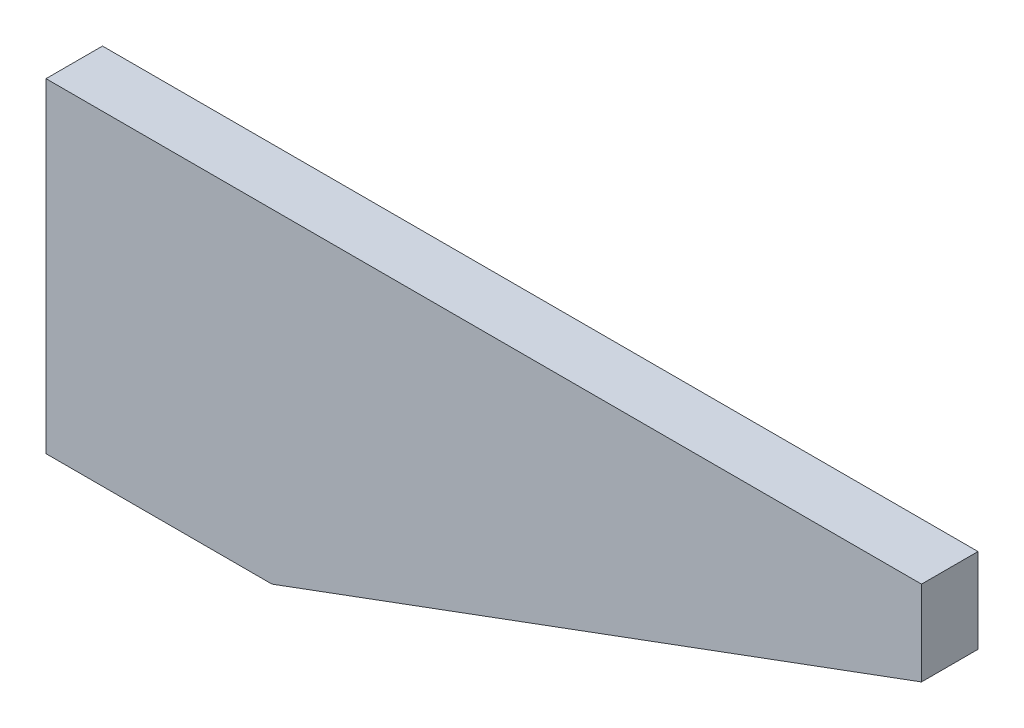
ISO-10303-21;
HEADER;
FILE_DESCRIPTION(('STEP AP214'),'2;1');
FILE_NAME('part.step','',(''),(''),'','','');
FILE_SCHEMA(('AUTOMOTIVE_DESIGN { 1 0 10303 214 1 1 1 1 }'));
ENDSEC;
DATA;
#1=APPLICATION_CONTEXT('core data for automotive mechanical design processes');
#2=APPLICATION_PROTOCOL_DEFINITION('international standard','automotive_design',2000,#1);
#3=PRODUCT_CONTEXT('',#1,'mechanical');
#4=PRODUCT('Part','Part','',(#3));
#5=PRODUCT_RELATED_PRODUCT_CATEGORY('part','',(#4));
#6=PRODUCT_DEFINITION_FORMATION('','',#4);
#7=PRODUCT_DEFINITION_CONTEXT('part definition',#1,'design');
#8=PRODUCT_DEFINITION('design','',#6,#7);
#9=PRODUCT_DEFINITION_SHAPE('','',#8);
#10=(LENGTH_UNIT() NAMED_UNIT(*) SI_UNIT(.MILLI.,.METRE.));
#11=(NAMED_UNIT(*) PLANE_ANGLE_UNIT() SI_UNIT($,.RADIAN.));
#12=(NAMED_UNIT(*) SI_UNIT($,.STERADIAN.) SOLID_ANGLE_UNIT());
#13=UNCERTAINTY_MEASURE_WITH_UNIT(LENGTH_MEASURE(1.E-05),#10,'distance_accuracy_value','');
#14=(GEOMETRIC_REPRESENTATION_CONTEXT(3) GLOBAL_UNCERTAINTY_ASSIGNED_CONTEXT((#13)) GLOBAL_UNIT_ASSIGNED_CONTEXT((#10,
#11,#12)) REPRESENTATION_CONTEXT('',''));
#15=CARTESIAN_POINT('',(0.,0.,0.));
#16=DIRECTION('',(0.,0.,1.));
#17=DIRECTION('',(1.,0.,0.));
#18=AXIS2_PLACEMENT_3D('',#15,#16,#17);
#19=CARTESIAN_POINT('',(-17.4568345323741,7.65287769784173,2.));
#20=DIRECTION('',(0.,-1.,0.));
#21=DIRECTION('',(0.,0.,-1.));
#22=AXIS2_PLACEMENT_3D('',#19,#20,#21);
#23=PLANE('',#22);
#24=DIRECTION('',(-1.,0.,0.));
#25=VECTOR('',#24,1.);
#26=CARTESIAN_POINT('',(-17.4568345323741,7.65287769784173,0.));
#27=LINE('',#26,#25);
#28=CARTESIAN_POINT('',(13.5431654676259,7.65287769784173,0.));
#29=VERTEX_POINT('',#28);
#30=CARTESIAN_POINT('',(-17.4568345323741,7.65287769784173,0.));
#31=VERTEX_POINT('',#30);
#32=EDGE_CURVE('E107',#29,#31,#27,.T.);
#33=ORIENTED_EDGE('',*,*,#32,.T.);
#34=DIRECTION('',(0.,0.,-1.));
#35=VECTOR('',#34,1.);
#36=CARTESIAN_POINT('',(-17.4568345323741,7.65287769784173,2.));
#37=LINE('',#36,#35);
#38=CARTESIAN_POINT('',(-17.4568345323741,7.65287769784173,2.));
#39=VERTEX_POINT('',#38);
#40=EDGE_CURVE('E11',#39,#31,#37,.T.);
#41=ORIENTED_EDGE('',*,*,#40,.F.);
#42=DIRECTION('',(-1.,0.,0.));
#43=VECTOR('',#42,1.);
#44=CARTESIAN_POINT('',(-17.4568345323741,7.65287769784173,2.));
#45=LINE('',#44,#43);
#46=CARTESIAN_POINT('',(13.5431654676259,7.65287769784173,2.));
#47=VERTEX_POINT('',#46);
#48=EDGE_CURVE('E115',#47,#39,#45,.T.);
#49=ORIENTED_EDGE('',*,*,#48,.F.);
#50=DIRECTION('',(0.,0.,-1.));
#51=VECTOR('',#50,1.);
#52=CARTESIAN_POINT('',(13.5431654676259,7.65287769784173,2.));
#53=LINE('',#52,#51);
#54=EDGE_CURVE('E103',#47,#29,#53,.T.);
#55=ORIENTED_EDGE('',*,*,#54,.T.);
#56=EDGE_LOOP('',(#33,#41,#49,#55));
#57=FACE_BOUND('',#56,.T.);
#58=ADVANCED_FACE('F33',(#57),#23,.F.);
#59=CARTESIAN_POINT('',(-17.4568345323741,7.65287769784173,2.));
#60=DIRECTION('',(1.,0.,0.));
#61=DIRECTION('',(0.,0.,-1.));
#62=AXIS2_PLACEMENT_3D('',#59,#60,#61);
#63=PLANE('',#62);
#64=DIRECTION('',(0.,-1.,0.));
#65=VECTOR('',#64,1.);
#66=CARTESIAN_POINT('',(-17.4568345323741,7.65287769784173,0.));
#67=LINE('',#66,#65);
#68=CARTESIAN_POINT('',(-17.4568345323741,-3.84712230215827,0.));
#69=VERTEX_POINT('',#68);
#70=EDGE_CURVE('E110',#31,#69,#67,.T.);
#71=ORIENTED_EDGE('',*,*,#70,.T.);
#72=DIRECTION('',(0.,0.,-1.));
#73=VECTOR('',#72,1.);
#74=CARTESIAN_POINT('',(-17.4568345323741,-3.84712230215827,2.));
#75=LINE('',#74,#73);
#76=CARTESIAN_POINT('',(-17.4568345323741,-3.84712230215827,2.));
#77=VERTEX_POINT('',#76);
#78=EDGE_CURVE('E41',#77,#69,#75,.T.);
#79=ORIENTED_EDGE('',*,*,#78,.F.);
#80=DIRECTION('',(0.,-1.,0.));
#81=VECTOR('',#80,1.);
#82=CARTESIAN_POINT('',(-17.4568345323741,7.65287769784173,2.));
#83=LINE('',#82,#81);
#84=EDGE_CURVE('E83',#39,#77,#83,.T.);
#85=ORIENTED_EDGE('',*,*,#84,.F.);
#86=ORIENTED_EDGE('',*,*,#40,.T.);
#87=EDGE_LOOP('',(#71,#79,#85,#86));
#88=FACE_BOUND('',#87,.T.);
#89=ADVANCED_FACE('F134',(#88),#63,.F.);
#90=CARTESIAN_POINT('',(-17.4568345323741,-3.84712230215827,2.));
#91=DIRECTION('',(0.,1.,0.));
#92=DIRECTION('',(0.,0.,1.));
#93=AXIS2_PLACEMENT_3D('',#90,#91,#92);
#94=PLANE('',#93);
#95=DIRECTION('',(1.,0.,0.));
#96=VECTOR('',#95,1.);
#97=CARTESIAN_POINT('',(-17.4568345323741,-3.84712230215827,0.));
#98=LINE('',#97,#96);
#99=CARTESIAN_POINT('',(-9.4568345323741,-3.84712230215827,0.));
#100=VERTEX_POINT('',#99);
#101=EDGE_CURVE('E98',#69,#100,#98,.T.);
#102=ORIENTED_EDGE('',*,*,#101,.T.);
#103=DIRECTION('',(0.,0.,-1.));
#104=VECTOR('',#103,1.);
#105=CARTESIAN_POINT('',(-9.4568345323741,-3.84712230215827,2.));
#106=LINE('',#105,#104);
#107=CARTESIAN_POINT('',(-9.4568345323741,-3.84712230215827,2.));
#108=VERTEX_POINT('',#107);
#109=EDGE_CURVE('E95',#108,#100,#106,.T.);
#110=ORIENTED_EDGE('',*,*,#109,.F.);
#111=DIRECTION('',(1.,0.,0.));
#112=VECTOR('',#111,1.);
#113=CARTESIAN_POINT('',(-17.4568345323741,-3.84712230215827,2.));
#114=LINE('',#113,#112);
#115=EDGE_CURVE('E87',#77,#108,#114,.T.);
#116=ORIENTED_EDGE('',*,*,#115,.F.);
#117=ORIENTED_EDGE('',*,*,#78,.T.);
#118=EDGE_LOOP('',(#102,#110,#116,#117));
#119=FACE_BOUND('',#118,.T.);
#120=ADVANCED_FACE('F96',(#119),#94,.F.);
#121=CARTESIAN_POINT('',(-9.4568345323741,-3.84712230215827,2.));
#122=DIRECTION('',(-0.346650140871629,0.937994498829114,0.));
#123=DIRECTION('',(-0.937994498829114,-0.346650140871629,0.));
#124=AXIS2_PLACEMENT_3D('',#121,#122,#123);
#125=PLANE('',#124);
#126=DIRECTION('',(0.937994498829114,0.346650140871629,0.));
#127=VECTOR('',#126,1.);
#128=CARTESIAN_POINT('',(-9.4568345323741,-3.84712230215827,0.));
#129=LINE('',#128,#127);
#130=CARTESIAN_POINT('',(13.5431654676259,4.65287769784173,0.));
#131=VERTEX_POINT('',#130);
#132=EDGE_CURVE('E69',#100,#131,#129,.T.);
#133=ORIENTED_EDGE('',*,*,#132,.T.);
#134=DIRECTION('',(0.,0.,-1.));
#135=VECTOR('',#134,1.);
#136=CARTESIAN_POINT('',(13.5431654676259,4.65287769784173,2.));
#137=LINE('',#136,#135);
#138=CARTESIAN_POINT('',(13.5431654676259,4.65287769784173,2.));
#139=VERTEX_POINT('',#138);
#140=EDGE_CURVE('E99',#139,#131,#137,.T.);
#141=ORIENTED_EDGE('',*,*,#140,.F.);
#142=DIRECTION('',(0.937994498829114,0.346650140871629,0.));
#143=VECTOR('',#142,1.);
#144=CARTESIAN_POINT('',(-9.4568345323741,-3.84712230215827,2.));
#145=LINE('',#144,#143);
#146=EDGE_CURVE('E91',#108,#139,#145,.T.);
#147=ORIENTED_EDGE('',*,*,#146,.F.);
#148=ORIENTED_EDGE('',*,*,#109,.T.);
#149=EDGE_LOOP('',(#133,#141,#147,#148));
#150=FACE_BOUND('',#149,.T.);
#151=ADVANCED_FACE('F101',(#150),#125,.F.);
#152=CARTESIAN_POINT('',(13.5431654676259,7.65287769784173,2.));
#153=DIRECTION('',(-1.,0.,0.));
#154=DIRECTION('',(0.,0.,1.));
#155=AXIS2_PLACEMENT_3D('',#152,#153,#154);
#156=PLANE('',#155);
#157=DIRECTION('',(0.,1.,0.));
#158=VECTOR('',#157,1.);
#159=CARTESIAN_POINT('',(13.5431654676259,7.65287769784173,0.));
#160=LINE('',#159,#158);
#161=EDGE_CURVE('E75',#131,#29,#160,.T.);
#162=ORIENTED_EDGE('',*,*,#161,.T.);
#163=ORIENTED_EDGE('',*,*,#54,.F.);
#164=DIRECTION('',(0.,1.,0.));
#165=VECTOR('',#164,1.);
#166=CARTESIAN_POINT('',(13.5431654676259,7.65287769784173,2.));
#167=LINE('',#166,#165);
#168=EDGE_CURVE('E49',#139,#47,#167,.T.);
#169=ORIENTED_EDGE('',*,*,#168,.F.);
#170=ORIENTED_EDGE('',*,*,#140,.T.);
#171=EDGE_LOOP('',(#162,#163,#169,#170));
#172=FACE_BOUND('',#171,.T.);
#173=ADVANCED_FACE('F123',(#172),#156,.F.);
#174=CARTESIAN_POINT('',(0.,0.,2.));
#175=DIRECTION('',(0.,0.,-1.));
#176=DIRECTION('',(-1.,0.,0.));
#177=AXIS2_PLACEMENT_3D('',#174,#175,#176);
#178=PLANE('',#177);
#179=ORIENTED_EDGE('',*,*,#48,.T.);
#180=ORIENTED_EDGE('',*,*,#84,.T.);
#181=ORIENTED_EDGE('',*,*,#115,.T.);
#182=ORIENTED_EDGE('',*,*,#146,.T.);
#183=ORIENTED_EDGE('',*,*,#168,.T.);
#184=EDGE_LOOP('',(#179,#180,#181,#182,#183));
#185=FACE_BOUND('',#184,.T.);
#186=ADVANCED_FACE('F89',(#185),#178,.F.);
#187=CARTESIAN_POINT('',(0.,0.,0.));
#188=DIRECTION('',(0.,0.,-1.));
#189=DIRECTION('',(-1.,0.,0.));
#190=AXIS2_PLACEMENT_3D('',#187,#188,#189);
#191=PLANE('',#190);
#192=ORIENTED_EDGE('',*,*,#32,.F.);
#193=ORIENTED_EDGE('',*,*,#161,.F.);
#194=ORIENTED_EDGE('',*,*,#132,.F.);
#195=ORIENTED_EDGE('',*,*,#101,.F.);
#196=ORIENTED_EDGE('',*,*,#70,.F.);
#197=EDGE_LOOP('',(#192,#193,#194,#195,#196));
#198=FACE_BOUND('',#197,.T.);
#199=ADVANCED_FACE('F119',(#198),#191,.T.);
#200=CLOSED_SHELL('',(#58,#89,#120,#151,#173,#186,#199));
#201=MANIFOLD_SOLID_BREP('B2',#200);
#202=ADVANCED_BREP_SHAPE_REPRESENTATION('',(#18,#201),#14);
#203=SHAPE_DEFINITION_REPRESENTATION(#9,#202);
ENDSEC;
END-ISO-10303-21;
